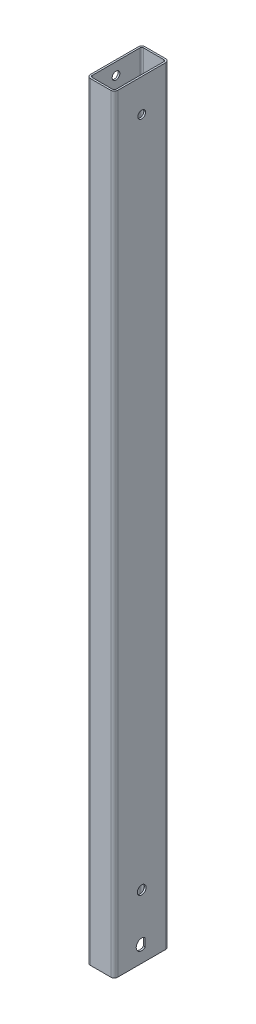
ISO-10303-21;
HEADER;
FILE_DESCRIPTION(('STEP AP214'),'2;1');
FILE_NAME('part.step','',(''),(''),'','','');
FILE_SCHEMA(('AUTOMOTIVE_DESIGN { 1 0 10303 214 1 1 1 1 }'));
ENDSEC;
DATA;
#1=APPLICATION_CONTEXT('core data for automotive mechanical design processes');
#2=APPLICATION_PROTOCOL_DEFINITION('international standard','automotive_design',2000,#1);
#3=PRODUCT_CONTEXT('',#1,'mechanical');
#4=PRODUCT('Part','Part','',(#3));
#5=PRODUCT_RELATED_PRODUCT_CATEGORY('part','',(#4));
#6=PRODUCT_DEFINITION_FORMATION('','',#4);
#7=PRODUCT_DEFINITION_CONTEXT('part definition',#1,'design');
#8=PRODUCT_DEFINITION('design','',#6,#7);
#9=PRODUCT_DEFINITION_SHAPE('','',#8);
#10=(LENGTH_UNIT() NAMED_UNIT(*) SI_UNIT(.MILLI.,.METRE.));
#11=(NAMED_UNIT(*) PLANE_ANGLE_UNIT() SI_UNIT($,.RADIAN.));
#12=(NAMED_UNIT(*) SI_UNIT($,.STERADIAN.) SOLID_ANGLE_UNIT());
#13=UNCERTAINTY_MEASURE_WITH_UNIT(LENGTH_MEASURE(1.E-05),#10,'distance_accuracy_value','');
#14=(GEOMETRIC_REPRESENTATION_CONTEXT(3) GLOBAL_UNCERTAINTY_ASSIGNED_CONTEXT((#13)) GLOBAL_UNIT_ASSIGNED_CONTEXT((#10,
#11,#12)) REPRESENTATION_CONTEXT('',''));
#15=CARTESIAN_POINT('',(0.,0.,0.));
#16=DIRECTION('',(0.,0.,1.));
#17=DIRECTION('',(1.,0.,0.));
#18=AXIS2_PLACEMENT_3D('',#15,#16,#17);
#19=CARTESIAN_POINT('',(12.5,0.,0.));
#20=DIRECTION('',(-1.,0.,0.));
#21=DIRECTION('',(0.,0.,1.));
#22=AXIS2_PLACEMENT_3D('',#19,#20,#21);
#23=CYLINDRICAL_SURFACE('',#22,5.);
#24=CARTESIAN_POINT('',(-10.9,0.,0.));
#25=DIRECTION('',(-1.,0.,0.));
#26=DIRECTION('',(0.,0.,1.));
#27=AXIS2_PLACEMENT_3D('',#24,#25,#26);
#28=CIRCLE('',#27,5.);
#29=CARTESIAN_POINT('',(-10.9,-4.33012701892219,-2.5));
#30=VERTEX_POINT('',#29);
#31=CARTESIAN_POINT('',(-10.9,4.33012701892219,-2.5));
#32=VERTEX_POINT('',#31);
#33=EDGE_CURVE('E308',#30,#32,#28,.T.);
#34=ORIENTED_EDGE('',*,*,#33,.F.);
#35=DIRECTION('',(-1.,0.,0.));
#36=VECTOR('',#35,1.);
#37=CARTESIAN_POINT('',(12.5,-4.33012701892219,-2.5));
#38=LINE('',#37,#36);
#39=CARTESIAN_POINT('',(-12.5,-4.33012701892219,-2.5));
#40=VERTEX_POINT('',#39);
#41=EDGE_CURVE('E361',#30,#40,#38,.T.);
#42=ORIENTED_EDGE('',*,*,#41,.T.);
#43=CARTESIAN_POINT('',(-12.5,0.,0.));
#44=DIRECTION('',(1.,0.,0.));
#45=DIRECTION('',(0.,0.,-1.));
#46=AXIS2_PLACEMENT_3D('',#43,#44,#45);
#47=CIRCLE('',#46,5.);
#48=CARTESIAN_POINT('',(-12.5,4.33012701892219,-2.5));
#49=VERTEX_POINT('',#48);
#50=EDGE_CURVE('E319',#49,#40,#47,.T.);
#51=ORIENTED_EDGE('',*,*,#50,.F.);
#52=DIRECTION('',(-1.,0.,0.));
#53=VECTOR('',#52,1.);
#54=CARTESIAN_POINT('',(12.5,4.33012701892219,-2.5));
#55=LINE('',#54,#53);
#56=EDGE_CURVE('E358',#49,#32,#55,.F.);
#57=ORIENTED_EDGE('',*,*,#56,.T.);
#58=EDGE_LOOP('',(#34,#42,#51,#57));
#59=FACE_BOUND('',#58,.T.);
#60=ADVANCED_FACE('F67',(#59),#23,.F.);
#61=CARTESIAN_POINT('',(-20.7462112512353,4.,-3.));
#62=DIRECTION('',(0.,0.,1.));
#63=DIRECTION('',(1.,0.,0.));
#64=AXIS2_PLACEMENT_3D('',#61,#62,#63);
#65=PLANE('',#64);
#66=DIRECTION('',(0.,-1.,0.));
#67=VECTOR('',#66,1.);
#68=CARTESIAN_POINT('',(-10.9,4.,-3.));
#69=LINE('',#68,#67);
#70=CARTESIAN_POINT('',(-10.9,3.46410161513775,-3.));
#71=VERTEX_POINT('',#70);
#72=CARTESIAN_POINT('',(-10.9,-3.46410161513775,-3.));
#73=VERTEX_POINT('',#72);
#74=EDGE_CURVE('E306',#71,#73,#69,.T.);
#75=ORIENTED_EDGE('',*,*,#74,.F.);
#76=DIRECTION('',(1.,0.,0.));
#77=VECTOR('',#76,1.);
#78=CARTESIAN_POINT('',(-12.5,3.46410161513775,-3.));
#79=LINE('',#78,#77);
#80=CARTESIAN_POINT('',(-12.5,3.46410161513775,-3.));
#81=VERTEX_POINT('',#80);
#82=EDGE_CURVE('E349',#71,#81,#79,.F.);
#83=ORIENTED_EDGE('',*,*,#82,.T.);
#84=DIRECTION('',(0.,-1.,0.));
#85=VECTOR('',#84,1.);
#86=CARTESIAN_POINT('',(-12.5,4.,-3.));
#87=LINE('',#86,#85);
#88=CARTESIAN_POINT('',(-12.5,-3.46410161513775,-3.));
#89=VERTEX_POINT('',#88);
#90=EDGE_CURVE('E316',#81,#89,#87,.T.);
#91=ORIENTED_EDGE('',*,*,#90,.T.);
#92=DIRECTION('',(1.,0.,0.));
#93=VECTOR('',#92,1.);
#94=CARTESIAN_POINT('',(12.5,-3.46410161513775,-3.));
#95=LINE('',#94,#93);
#96=EDGE_CURVE('E354',#89,#73,#95,.T.);
#97=ORIENTED_EDGE('',*,*,#96,.T.);
#98=EDGE_LOOP('',(#75,#83,#91,#97));
#99=FACE_BOUND('',#98,.T.);
#100=ADVANCED_FACE('F450',(#99),#65,.T.);
#101=CARTESIAN_POINT('',(12.5,-3.46410161513775,-2.));
#102=DIRECTION('',(-1.,0.,0.));
#103=DIRECTION('',(0.,0.,1.));
#104=AXIS2_PLACEMENT_3D('',#101,#102,#103);
#105=CYLINDRICAL_SURFACE('',#104,1.);
#106=ORIENTED_EDGE('',*,*,#41,.F.);
#107=CARTESIAN_POINT('',(-10.9,-3.46410161513775,-2.));
#108=DIRECTION('',(-1.,0.,0.));
#109=DIRECTION('',(0.,0.,1.));
#110=AXIS2_PLACEMENT_3D('',#107,#108,#109);
#111=CIRCLE('',#110,1.);
#112=EDGE_CURVE('E310',#30,#73,#111,.F.);
#113=ORIENTED_EDGE('',*,*,#112,.T.);
#114=ORIENTED_EDGE('',*,*,#96,.F.);
#115=CARTESIAN_POINT('',(-12.5,-3.46410161513775,-2.));
#116=DIRECTION('',(-1.,0.,0.));
#117=DIRECTION('',(0.,0.,1.));
#118=AXIS2_PLACEMENT_3D('',#115,#116,#117);
#119=CIRCLE('',#118,1.);
#120=EDGE_CURVE('E367',#40,#89,#119,.F.);
#121=ORIENTED_EDGE('',*,*,#120,.F.);
#122=EDGE_LOOP('',(#106,#113,#114,#121));
#123=FACE_BOUND('',#122,.T.);
#124=ADVANCED_FACE('F457',(#123),#105,.F.);
#125=CARTESIAN_POINT('',(12.5,3.46410161513775,-2.));
#126=DIRECTION('',(-1.,0.,0.));
#127=DIRECTION('',(0.,0.,1.));
#128=AXIS2_PLACEMENT_3D('',#125,#126,#127);
#129=CYLINDRICAL_SURFACE('',#128,1.);
#130=ORIENTED_EDGE('',*,*,#82,.F.);
#131=CARTESIAN_POINT('',(-10.9,3.46410161513775,-2.));
#132=DIRECTION('',(-1.,0.,0.));
#133=DIRECTION('',(0.,0.,1.));
#134=AXIS2_PLACEMENT_3D('',#131,#132,#133);
#135=CIRCLE('',#134,1.);
#136=EDGE_CURVE('E12',#71,#32,#135,.F.);
#137=ORIENTED_EDGE('',*,*,#136,.T.);
#138=ORIENTED_EDGE('',*,*,#56,.F.);
#139=CARTESIAN_POINT('',(-12.5,3.46410161513775,-2.));
#140=DIRECTION('',(-1.,0.,0.));
#141=DIRECTION('',(0.,0.,1.));
#142=AXIS2_PLACEMENT_3D('',#139,#140,#141);
#143=CIRCLE('',#142,1.);
#144=EDGE_CURVE('E371',#81,#49,#143,.F.);
#145=ORIENTED_EDGE('',*,*,#144,.F.);
#146=EDGE_LOOP('',(#130,#137,#138,#145));
#147=FACE_BOUND('',#146,.T.);
#148=ADVANCED_FACE('F491',(#147),#129,.F.);
#149=CARTESIAN_POINT('',(12.5,0.,0.));
#150=DIRECTION('',(-1.,0.,0.));
#151=DIRECTION('',(0.,0.,1.));
#152=AXIS2_PLACEMENT_3D('',#149,#150,#151);
#153=PLANE('',#152);
#154=CARTESIAN_POINT('',(12.5,655.,0.));
#155=DIRECTION('',(1.,0.,0.));
#156=DIRECTION('',(0.,0.,-1.));
#157=AXIS2_PLACEMENT_3D('',#154,#155,#156);
#158=CIRCLE('',#157,3.5);
#159=CARTESIAN_POINT('',(12.5,655.,-3.5));
#160=VERTEX_POINT('',#159);
#161=EDGE_CURVE('E555',#160,#160,#158,.T.);
#162=ORIENTED_EDGE('',*,*,#161,.F.);
#163=EDGE_LOOP('',(#162));
#164=FACE_BOUND('',#163,.T.);
#165=CARTESIAN_POINT('',(12.5,43.,0.));
#166=DIRECTION('',(1.,0.,0.));
#167=DIRECTION('',(0.,0.,-1.));
#168=AXIS2_PLACEMENT_3D('',#165,#166,#167);
#169=CIRCLE('',#168,4.);
#170=CARTESIAN_POINT('',(12.5,43.,-4.));
#171=VERTEX_POINT('',#170);
#172=EDGE_CURVE('E253',#171,#171,#169,.T.);
#173=ORIENTED_EDGE('',*,*,#172,.F.);
#174=EDGE_LOOP('',(#173));
#175=FACE_BOUND('',#174,.T.);
#176=DIRECTION('',(0.,0.,-1.));
#177=VECTOR('',#176,1.);
#178=CARTESIAN_POINT('',(12.5,-15.,25.));
#179=LINE('',#178,#177);
#180=CARTESIAN_POINT('',(12.5,-15.,21.8));
#181=VERTEX_POINT('',#180);
#182=CARTESIAN_POINT('',(12.5,-15.,-21.8));
#183=VERTEX_POINT('',#182);
#184=EDGE_CURVE('E329',#181,#183,#179,.T.);
#185=ORIENTED_EDGE('',*,*,#184,.T.);
#186=DIRECTION('',(0.,1.,0.));
#187=VECTOR('',#186,1.);
#188=CARTESIAN_POINT('',(12.5,0.,-21.8));
#189=LINE('',#188,#187);
#190=CARTESIAN_POINT('',(12.5,685.,-21.8));
#191=VERTEX_POINT('',#190);
#192=EDGE_CURVE('E376',#183,#191,#189,.T.);
#193=ORIENTED_EDGE('',*,*,#192,.T.);
#194=DIRECTION('',(0.,0.,1.));
#195=VECTOR('',#194,1.);
#196=CARTESIAN_POINT('',(12.5,685.,25.));
#197=LINE('',#196,#195);
#198=CARTESIAN_POINT('',(12.5,685.,21.8));
#199=VERTEX_POINT('',#198);
#200=EDGE_CURVE('E326',#191,#199,#197,.T.);
#201=ORIENTED_EDGE('',*,*,#200,.T.);
#202=DIRECTION('',(0.,-1.,0.));
#203=VECTOR('',#202,1.);
#204=CARTESIAN_POINT('',(12.5,0.,21.8));
#205=LINE('',#204,#203);
#206=EDGE_CURVE('E373',#199,#181,#205,.T.);
#207=ORIENTED_EDGE('',*,*,#206,.T.);
#208=EDGE_LOOP('',(#185,#193,#201,#207));
#209=FACE_BOUND('',#208,.T.);
#210=CARTESIAN_POINT('',(12.5,0.,0.));
#211=DIRECTION('',(1.,0.,0.));
#212=DIRECTION('',(0.,0.,-1.));
#213=AXIS2_PLACEMENT_3D('',#210,#211,#212);
#214=CIRCLE('',#213,5.);
#215=CARTESIAN_POINT('',(12.5,4.33012701892219,-2.5));
#216=VERTEX_POINT('',#215);
#217=CARTESIAN_POINT('',(12.5,-4.33012701892219,-2.5));
#218=VERTEX_POINT('',#217);
#219=EDGE_CURVE('E320',#216,#218,#214,.T.);
#220=ORIENTED_EDGE('',*,*,#219,.F.);
#221=CARTESIAN_POINT('',(12.5,3.46410161513775,-2.));
#222=DIRECTION('',(-1.,0.,0.));
#223=DIRECTION('',(0.,0.,1.));
#224=AXIS2_PLACEMENT_3D('',#221,#222,#223);
#225=CIRCLE('',#224,1.);
#226=CARTESIAN_POINT('',(12.5,3.46410161513775,-3.));
#227=VERTEX_POINT('',#226);
#228=EDGE_CURVE('E369',#216,#227,#225,.T.);
#229=ORIENTED_EDGE('',*,*,#228,.T.);
#230=DIRECTION('',(0.,-1.,0.));
#231=VECTOR('',#230,1.);
#232=CARTESIAN_POINT('',(12.5,4.,-3.));
#233=LINE('',#232,#231);
#234=CARTESIAN_POINT('',(12.5,-3.46410161513775,-3.));
#235=VERTEX_POINT('',#234);
#236=EDGE_CURVE('E313',#227,#235,#233,.T.);
#237=ORIENTED_EDGE('',*,*,#236,.T.);
#238=CARTESIAN_POINT('',(12.5,-3.46410161513775,-2.));
#239=DIRECTION('',(-1.,0.,0.));
#240=DIRECTION('',(0.,0.,1.));
#241=AXIS2_PLACEMENT_3D('',#238,#239,#240);
#242=CIRCLE('',#241,1.);
#243=EDGE_CURVE('E365',#235,#218,#242,.T.);
#244=ORIENTED_EDGE('',*,*,#243,.T.);
#245=EDGE_LOOP('',(#220,#229,#237,#244));
#246=FACE_BOUND('',#245,.T.);
#247=ADVANCED_FACE('F424',(#164,#175,#209,#246),#153,.F.);
#248=CARTESIAN_POINT('',(-12.5,0.,0.));
#249=DIRECTION('',(-1.,0.,0.));
#250=DIRECTION('',(0.,0.,1.));
#251=AXIS2_PLACEMENT_3D('',#248,#249,#250);
#252=PLANE('',#251);
#253=CARTESIAN_POINT('',(-12.5,674.,0.));
#254=DIRECTION('',(-1.,0.,0.));
#255=DIRECTION('',(0.,0.,1.));
#256=AXIS2_PLACEMENT_3D('',#253,#254,#255);
#257=CIRCLE('',#256,3.5);
#258=CARTESIAN_POINT('',(-12.5,674.,3.5));
#259=VERTEX_POINT('',#258);
#260=EDGE_CURVE('E587',#259,#259,#257,.T.);
#261=ORIENTED_EDGE('',*,*,#260,.F.);
#262=EDGE_LOOP('',(#261));
#263=FACE_BOUND('',#262,.T.);
#264=CARTESIAN_POINT('',(-12.5,656.,0.));
#265=DIRECTION('',(-1.,0.,0.));
#266=DIRECTION('',(0.,0.,1.));
#267=AXIS2_PLACEMENT_3D('',#264,#265,#266);
#268=CIRCLE('',#267,3.5);
#269=CARTESIAN_POINT('',(-12.5,656.,3.5));
#270=VERTEX_POINT('',#269);
#271=EDGE_CURVE('E584',#270,#270,#268,.T.);
#272=ORIENTED_EDGE('',*,*,#271,.F.);
#273=EDGE_LOOP('',(#272));
#274=FACE_BOUND('',#273,.T.);
#275=DIRECTION('',(0.,0.,1.));
#276=VECTOR('',#275,1.);
#277=CARTESIAN_POINT('',(-12.5,685.,25.));
#278=LINE('',#277,#276);
#279=CARTESIAN_POINT('',(-12.5,685.,-21.8));
#280=VERTEX_POINT('',#279);
#281=CARTESIAN_POINT('',(-12.5,685.,21.8));
#282=VERTEX_POINT('',#281);
#283=EDGE_CURVE('E323',#280,#282,#278,.T.);
#284=ORIENTED_EDGE('',*,*,#283,.F.);
#285=DIRECTION('',(0.,1.,0.));
#286=VECTOR('',#285,1.);
#287=CARTESIAN_POINT('',(-12.5,-15.,-21.8));
#288=LINE('',#287,#286);
#289=CARTESIAN_POINT('',(-12.5,-15.,-21.8));
#290=VERTEX_POINT('',#289);
#291=EDGE_CURVE('E402',#280,#290,#288,.F.);
#292=ORIENTED_EDGE('',*,*,#291,.T.);
#293=DIRECTION('',(0.,0.,-1.));
#294=VECTOR('',#293,1.);
#295=CARTESIAN_POINT('',(-12.5,-15.,25.));
#296=LINE('',#295,#294);
#297=CARTESIAN_POINT('',(-12.5,-15.,21.8));
#298=VERTEX_POINT('',#297);
#299=EDGE_CURVE('E330',#298,#290,#296,.T.);
#300=ORIENTED_EDGE('',*,*,#299,.F.);
#301=DIRECTION('',(0.,-1.,0.));
#302=VECTOR('',#301,1.);
#303=CARTESIAN_POINT('',(-12.5,685.,21.8));
#304=LINE('',#303,#302);
#305=EDGE_CURVE('E400',#298,#282,#304,.F.);
#306=ORIENTED_EDGE('',*,*,#305,.T.);
#307=EDGE_LOOP('',(#284,#292,#300,#306));
#308=FACE_BOUND('',#307,.T.);
#309=ORIENTED_EDGE('',*,*,#90,.F.);
#310=ORIENTED_EDGE('',*,*,#144,.T.);
#311=ORIENTED_EDGE('',*,*,#50,.T.);
#312=ORIENTED_EDGE('',*,*,#120,.T.);
#313=EDGE_LOOP('',(#309,#310,#311,#312));
#314=FACE_BOUND('',#313,.T.);
#315=ADVANCED_FACE('F479',(#263,#274,#308,#314),#252,.T.);
#316=CARTESIAN_POINT('',(12.5,-15.,-25.));
#317=DIRECTION('',(0.,0.,1.));
#318=DIRECTION('',(1.,0.,0.));
#319=AXIS2_PLACEMENT_3D('',#316,#317,#318);
#320=PLANE('',#319);
#321=CARTESIAN_POINT('',(0.,665.,-25.));
#322=DIRECTION('',(0.,0.,-1.));
#323=DIRECTION('',(-1.,0.,0.));
#324=AXIS2_PLACEMENT_3D('',#321,#322,#323);
#325=CIRCLE('',#324,5.);
#326=CARTESIAN_POINT('',(-5.,665.,-25.));
#327=VERTEX_POINT('',#326);
#328=EDGE_CURVE('E568',#327,#327,#325,.T.);
#329=ORIENTED_EDGE('',*,*,#328,.F.);
#330=EDGE_LOOP('',(#329));
#331=FACE_BOUND('',#330,.T.);
#332=CARTESIAN_POINT('',(0.,565.,-25.));
#333=DIRECTION('',(0.,0.,-1.));
#334=DIRECTION('',(-1.,0.,0.));
#335=AXIS2_PLACEMENT_3D('',#332,#333,#334);
#336=CIRCLE('',#335,5.);
#337=CARTESIAN_POINT('',(-5.00000000000002,565.,-25.));
#338=VERTEX_POINT('',#337);
#339=EDGE_CURVE('E573',#338,#338,#336,.T.);
#340=ORIENTED_EDGE('',*,*,#339,.F.);
#341=EDGE_LOOP('',(#340));
#342=FACE_BOUND('',#341,.T.);
#343=DIRECTION('',(-1.,0.,0.));
#344=VECTOR('',#343,1.);
#345=CARTESIAN_POINT('',(12.5,685.,-25.));
#346=LINE('',#345,#344);
#347=CARTESIAN_POINT('',(9.3,685.,-25.));
#348=VERTEX_POINT('',#347);
#349=CARTESIAN_POINT('',(-9.3,685.,-25.));
#350=VERTEX_POINT('',#349);
#351=EDGE_CURVE('E346',#348,#350,#346,.T.);
#352=ORIENTED_EDGE('',*,*,#351,.F.);
#353=DIRECTION('',(0.,1.,0.));
#354=VECTOR('',#353,1.);
#355=CARTESIAN_POINT('',(9.3,-15.,-25.));
#356=LINE('',#355,#354);
#357=CARTESIAN_POINT('',(9.3,-15.,-25.));
#358=VERTEX_POINT('',#357);
#359=EDGE_CURVE('E390',#348,#358,#356,.F.);
#360=ORIENTED_EDGE('',*,*,#359,.T.);
#361=DIRECTION('',(-1.,0.,0.));
#362=VECTOR('',#361,1.);
#363=CARTESIAN_POINT('',(12.5,-15.,-25.));
#364=LINE('',#363,#362);
#365=CARTESIAN_POINT('',(-9.3,-15.,-25.));
#366=VERTEX_POINT('',#365);
#367=EDGE_CURVE('E333',#358,#366,#364,.T.);
#368=ORIENTED_EDGE('',*,*,#367,.T.);
#369=DIRECTION('',(0.,1.,0.));
#370=VECTOR('',#369,1.);
#371=CARTESIAN_POINT('',(-9.3,685.,-25.));
#372=LINE('',#371,#370);
#373=EDGE_CURVE('E387',#366,#350,#372,.T.);
#374=ORIENTED_EDGE('',*,*,#373,.T.);
#375=EDGE_LOOP('',(#352,#360,#368,#374));
#376=FACE_BOUND('',#375,.T.);
#377=ADVANCED_FACE('F482',(#331,#342,#376),#320,.F.);
#378=CARTESIAN_POINT('',(12.5,685.,25.));
#379=DIRECTION('',(0.,-1.,0.));
#380=DIRECTION('',(0.,0.,-1.));
#381=AXIS2_PLACEMENT_3D('',#378,#379,#380);
#382=PLANE('',#381);
#383=DIRECTION('',(0.,0.,-1.));
#384=VECTOR('',#383,1.);
#385=CARTESIAN_POINT('',(-10.9,685.,21.8));
#386=LINE('',#385,#384);
#387=CARTESIAN_POINT('',(-10.9,685.,21.8));
#388=VERTEX_POINT('',#387);
#389=CARTESIAN_POINT('',(-10.9,685.,-21.8));
#390=VERTEX_POINT('',#389);
#391=EDGE_CURVE('E236',#388,#390,#386,.T.);
#392=ORIENTED_EDGE('',*,*,#391,.T.);
#393=CARTESIAN_POINT('',(-9.3,685.,-21.8));
#394=DIRECTION('',(0.,-1.,0.));
#395=DIRECTION('',(0.,0.,-1.));
#396=AXIS2_PLACEMENT_3D('',#393,#394,#395);
#397=CIRCLE('',#396,1.6);
#398=CARTESIAN_POINT('',(-9.3,685.,-23.4));
#399=VERTEX_POINT('',#398);
#400=EDGE_CURVE('E230',#390,#399,#397,.T.);
#401=ORIENTED_EDGE('',*,*,#400,.T.);
#402=DIRECTION('',(1.,0.,0.));
#403=VECTOR('',#402,1.);
#404=CARTESIAN_POINT('',(-9.3,685.,-23.4));
#405=LINE('',#404,#403);
#406=CARTESIAN_POINT('',(9.3,685.,-23.4));
#407=VERTEX_POINT('',#406);
#408=EDGE_CURVE('E239',#399,#407,#405,.T.);
#409=ORIENTED_EDGE('',*,*,#408,.T.);
#410=CARTESIAN_POINT('',(9.3,685.,-21.8));
#411=DIRECTION('',(0.,-1.,0.));
#412=DIRECTION('',(0.,0.,-1.));
#413=AXIS2_PLACEMENT_3D('',#410,#411,#412);
#414=CIRCLE('',#413,1.6);
#415=CARTESIAN_POINT('',(10.9,685.,-21.8));
#416=VERTEX_POINT('',#415);
#417=EDGE_CURVE('E82',#407,#416,#414,.T.);
#418=ORIENTED_EDGE('',*,*,#417,.T.);
#419=DIRECTION('',(0.,0.,1.));
#420=VECTOR('',#419,1.);
#421=CARTESIAN_POINT('',(10.9,685.,-21.8));
#422=LINE('',#421,#420);
#423=CARTESIAN_POINT('',(10.9,685.,21.8));
#424=VERTEX_POINT('',#423);
#425=EDGE_CURVE('E257',#416,#424,#422,.T.);
#426=ORIENTED_EDGE('',*,*,#425,.T.);
#427=CARTESIAN_POINT('',(9.3,685.,21.8));
#428=DIRECTION('',(0.,-1.,0.));
#429=DIRECTION('',(0.,0.,-1.));
#430=AXIS2_PLACEMENT_3D('',#427,#428,#429);
#431=CIRCLE('',#430,1.6);
#432=CARTESIAN_POINT('',(9.3,685.,23.4));
#433=VERTEX_POINT('',#432);
#434=EDGE_CURVE('E260',#424,#433,#431,.T.);
#435=ORIENTED_EDGE('',*,*,#434,.T.);
#436=DIRECTION('',(-1.,0.,0.));
#437=VECTOR('',#436,1.);
#438=CARTESIAN_POINT('',(9.3,685.,23.4));
#439=LINE('',#438,#437);
#440=CARTESIAN_POINT('',(-9.3,685.,23.4));
#441=VERTEX_POINT('',#440);
#442=EDGE_CURVE('E263',#433,#441,#439,.T.);
#443=ORIENTED_EDGE('',*,*,#442,.T.);
#444=CARTESIAN_POINT('',(-9.3,685.,21.8));
#445=DIRECTION('',(0.,-1.,0.));
#446=DIRECTION('',(0.,0.,-1.));
#447=AXIS2_PLACEMENT_3D('',#444,#445,#446);
#448=CIRCLE('',#447,1.6);
#449=EDGE_CURVE('E266',#441,#388,#448,.T.);
#450=ORIENTED_EDGE('',*,*,#449,.T.);
#451=EDGE_LOOP('',(#392,#401,#409,#418,#426,#435,#443,#450));
#452=FACE_BOUND('',#451,.T.);
#453=ORIENTED_EDGE('',*,*,#200,.F.);
#454=CARTESIAN_POINT('',(9.3,685.,-21.8));
#455=DIRECTION('',(0.,-1.,0.));
#456=DIRECTION('',(0.,0.,-1.));
#457=AXIS2_PLACEMENT_3D('',#454,#455,#456);
#458=CIRCLE('',#457,3.2);
#459=EDGE_CURVE('E385',#191,#348,#458,.F.);
#460=ORIENTED_EDGE('',*,*,#459,.T.);
#461=ORIENTED_EDGE('',*,*,#351,.T.);
#462=CARTESIAN_POINT('',(-9.3,685.,-21.8));
#463=DIRECTION('',(0.,-1.,0.));
#464=DIRECTION('',(0.,0.,-1.));
#465=AXIS2_PLACEMENT_3D('',#462,#463,#464);
#466=CIRCLE('',#465,3.2);
#467=EDGE_CURVE('E383',#350,#280,#466,.F.);
#468=ORIENTED_EDGE('',*,*,#467,.T.);
#469=ORIENTED_EDGE('',*,*,#283,.T.);
#470=CARTESIAN_POINT('',(-9.3,685.,21.8));
#471=DIRECTION('',(0.,-1.,0.));
#472=DIRECTION('',(0.,0.,-1.));
#473=AXIS2_PLACEMENT_3D('',#470,#471,#472);
#474=CIRCLE('',#473,3.2);
#475=CARTESIAN_POINT('',(-9.3,685.,25.));
#476=VERTEX_POINT('',#475);
#477=EDGE_CURVE('E379',#282,#476,#474,.F.);
#478=ORIENTED_EDGE('',*,*,#477,.T.);
#479=DIRECTION('',(-1.,0.,0.));
#480=VECTOR('',#479,1.);
#481=CARTESIAN_POINT('',(12.5,685.,25.));
#482=LINE('',#481,#480);
#483=CARTESIAN_POINT('',(9.3,685.,25.));
#484=VERTEX_POINT('',#483);
#485=EDGE_CURVE('E343',#484,#476,#482,.T.);
#486=ORIENTED_EDGE('',*,*,#485,.F.);
#487=CARTESIAN_POINT('',(9.3,685.,21.8));
#488=DIRECTION('',(0.,-1.,0.));
#489=DIRECTION('',(0.,0.,-1.));
#490=AXIS2_PLACEMENT_3D('',#487,#488,#489);
#491=CIRCLE('',#490,3.2);
#492=EDGE_CURVE('E381',#484,#199,#491,.F.);
#493=ORIENTED_EDGE('',*,*,#492,.T.);
#494=EDGE_LOOP('',(#453,#460,#461,#468,#469,#478,#486,#493));
#495=FACE_BOUND('',#494,.T.);
#496=ADVANCED_FACE('F243',(#452,#495),#382,.F.);
#497=CARTESIAN_POINT('',(12.5,-15.,25.));
#498=DIRECTION('',(0.,0.,-1.));
#499=DIRECTION('',(-1.,0.,0.));
#500=AXIS2_PLACEMENT_3D('',#497,#498,#499);
#501=PLANE('',#500);
#502=DIRECTION('',(-1.,0.,0.));
#503=VECTOR('',#502,1.);
#504=CARTESIAN_POINT('',(12.5,-15.,25.));
#505=LINE('',#504,#503);
#506=CARTESIAN_POINT('',(9.3,-15.,25.));
#507=VERTEX_POINT('',#506);
#508=CARTESIAN_POINT('',(-9.3,-15.,25.));
#509=VERTEX_POINT('',#508);
#510=EDGE_CURVE('E340',#507,#509,#505,.T.);
#511=ORIENTED_EDGE('',*,*,#510,.F.);
#512=DIRECTION('',(0.,-1.,0.));
#513=VECTOR('',#512,1.);
#514=CARTESIAN_POINT('',(9.3,-15.,25.));
#515=LINE('',#514,#513);
#516=EDGE_CURVE('E407',#507,#484,#515,.F.);
#517=ORIENTED_EDGE('',*,*,#516,.T.);
#518=ORIENTED_EDGE('',*,*,#485,.T.);
#519=DIRECTION('',(0.,-1.,0.));
#520=VECTOR('',#519,1.);
#521=CARTESIAN_POINT('',(-9.3,-15.,25.));
#522=LINE('',#521,#520);
#523=EDGE_CURVE('E404',#476,#509,#522,.T.);
#524=ORIENTED_EDGE('',*,*,#523,.T.);
#525=EDGE_LOOP('',(#511,#517,#518,#524));
#526=FACE_BOUND('',#525,.T.);
#527=ADVANCED_FACE('F468',(#526),#501,.F.);
#528=CARTESIAN_POINT('',(12.5,-15.,25.));
#529=DIRECTION('',(0.,1.,0.));
#530=DIRECTION('',(0.,0.,1.));
#531=AXIS2_PLACEMENT_3D('',#528,#529,#530);
#532=PLANE('',#531);
#533=DIRECTION('',(1.,0.,0.));
#534=VECTOR('',#533,1.);
#535=CARTESIAN_POINT('',(-9.3,-15.,-23.4));
#536=LINE('',#535,#534);
#537=CARTESIAN_POINT('',(-9.3,-15.,-23.4));
#538=VERTEX_POINT('',#537);
#539=CARTESIAN_POINT('',(9.3,-15.,-23.4));
#540=VERTEX_POINT('',#539);
#541=EDGE_CURVE('E270',#538,#540,#536,.T.);
#542=ORIENTED_EDGE('',*,*,#541,.F.);
#543=CARTESIAN_POINT('',(-9.3,-15.,-21.8));
#544=DIRECTION('',(0.,-1.,0.));
#545=DIRECTION('',(0.,0.,-1.));
#546=AXIS2_PLACEMENT_3D('',#543,#544,#545);
#547=CIRCLE('',#546,1.6);
#548=CARTESIAN_POINT('',(-10.9,-15.,-21.8));
#549=VERTEX_POINT('',#548);
#550=EDGE_CURVE('E90',#549,#538,#547,.T.);
#551=ORIENTED_EDGE('',*,*,#550,.F.);
#552=DIRECTION('',(0.,0.,-1.));
#553=VECTOR('',#552,1.);
#554=CARTESIAN_POINT('',(-10.9,-15.,21.8));
#555=LINE('',#554,#553);
#556=CARTESIAN_POINT('',(-10.9,-15.,21.8));
#557=VERTEX_POINT('',#556);
#558=EDGE_CURVE('E247',#557,#549,#555,.T.);
#559=ORIENTED_EDGE('',*,*,#558,.F.);
#560=CARTESIAN_POINT('',(-9.3,-15.,21.8));
#561=DIRECTION('',(0.,-1.,0.));
#562=DIRECTION('',(0.,0.,-1.));
#563=AXIS2_PLACEMENT_3D('',#560,#561,#562);
#564=CIRCLE('',#563,1.6);
#565=CARTESIAN_POINT('',(-9.3,-15.,23.4));
#566=VERTEX_POINT('',#565);
#567=EDGE_CURVE('E250',#566,#557,#564,.T.);
#568=ORIENTED_EDGE('',*,*,#567,.F.);
#569=DIRECTION('',(-1.,0.,0.));
#570=VECTOR('',#569,1.);
#571=CARTESIAN_POINT('',(9.3,-15.,23.4));
#572=LINE('',#571,#570);
#573=CARTESIAN_POINT('',(9.3,-15.,23.4));
#574=VERTEX_POINT('',#573);
#575=EDGE_CURVE('E281',#574,#566,#572,.T.);
#576=ORIENTED_EDGE('',*,*,#575,.F.);
#577=CARTESIAN_POINT('',(9.3,-15.,21.8));
#578=DIRECTION('',(0.,-1.,0.));
#579=DIRECTION('',(0.,0.,-1.));
#580=AXIS2_PLACEMENT_3D('',#577,#578,#579);
#581=CIRCLE('',#580,1.6);
#582=CARTESIAN_POINT('',(10.9,-15.,21.8));
#583=VERTEX_POINT('',#582);
#584=EDGE_CURVE('E278',#583,#574,#581,.T.);
#585=ORIENTED_EDGE('',*,*,#584,.F.);
#586=DIRECTION('',(0.,0.,1.));
#587=VECTOR('',#586,1.);
#588=CARTESIAN_POINT('',(10.9,-15.,-21.8));
#589=LINE('',#588,#587);
#590=CARTESIAN_POINT('',(10.9,-15.,-21.8));
#591=VERTEX_POINT('',#590);
#592=EDGE_CURVE('E275',#591,#583,#589,.T.);
#593=ORIENTED_EDGE('',*,*,#592,.F.);
#594=CARTESIAN_POINT('',(9.3,-15.,-21.8));
#595=DIRECTION('',(0.,-1.,0.));
#596=DIRECTION('',(0.,0.,-1.));
#597=AXIS2_PLACEMENT_3D('',#594,#595,#596);
#598=CIRCLE('',#597,1.6);
#599=EDGE_CURVE('E272',#540,#591,#598,.T.);
#600=ORIENTED_EDGE('',*,*,#599,.F.);
#601=EDGE_LOOP('',(#542,#551,#559,#568,#576,#585,#593,#600));
#602=FACE_BOUND('',#601,.T.);
#603=ORIENTED_EDGE('',*,*,#367,.F.);
#604=CARTESIAN_POINT('',(9.3,-15.,-21.8));
#605=DIRECTION('',(0.,1.,0.));
#606=DIRECTION('',(0.,0.,1.));
#607=AXIS2_PLACEMENT_3D('',#604,#605,#606);
#608=CIRCLE('',#607,3.2);
#609=EDGE_CURVE('E398',#358,#183,#608,.F.);
#610=ORIENTED_EDGE('',*,*,#609,.T.);
#611=ORIENTED_EDGE('',*,*,#184,.F.);
#612=CARTESIAN_POINT('',(9.3,-15.,21.8));
#613=DIRECTION('',(0.,1.,0.));
#614=DIRECTION('',(0.,0.,1.));
#615=AXIS2_PLACEMENT_3D('',#612,#613,#614);
#616=CIRCLE('',#615,3.2);
#617=EDGE_CURVE('E394',#181,#507,#616,.F.);
#618=ORIENTED_EDGE('',*,*,#617,.T.);
#619=ORIENTED_EDGE('',*,*,#510,.T.);
#620=CARTESIAN_POINT('',(-9.3,-15.,21.8));
#621=DIRECTION('',(0.,1.,0.));
#622=DIRECTION('',(0.,0.,1.));
#623=AXIS2_PLACEMENT_3D('',#620,#621,#622);
#624=CIRCLE('',#623,3.2);
#625=EDGE_CURVE('E392',#509,#298,#624,.F.);
#626=ORIENTED_EDGE('',*,*,#625,.T.);
#627=ORIENTED_EDGE('',*,*,#299,.T.);
#628=CARTESIAN_POINT('',(-9.3,-15.,-21.8));
#629=DIRECTION('',(0.,1.,0.));
#630=DIRECTION('',(0.,0.,1.));
#631=AXIS2_PLACEMENT_3D('',#628,#629,#630);
#632=CIRCLE('',#631,3.2);
#633=EDGE_CURVE('E396',#290,#366,#632,.F.);
#634=ORIENTED_EDGE('',*,*,#633,.T.);
#635=EDGE_LOOP('',(#603,#610,#611,#618,#619,#626,#627,#634));
#636=FACE_BOUND('',#635,.T.);
#637=ADVANCED_FACE('F463',(#602,#636),#532,.F.);
#638=CARTESIAN_POINT('',(10.9,0.,0.));
#639=DIRECTION('',(1.,0.,0.));
#640=DIRECTION('',(0.,0.,-1.));
#641=AXIS2_PLACEMENT_3D('',#638,#639,#640);
#642=CIRCLE('',#641,5.);
#643=CARTESIAN_POINT('',(10.9,4.33012701892219,-2.5));
#644=VERTEX_POINT('',#643);
#645=CARTESIAN_POINT('',(10.9,-4.33012701892219,-2.5));
#646=VERTEX_POINT('',#645);
#647=EDGE_CURVE('E301',#644,#646,#642,.T.);
#648=ORIENTED_EDGE('',*,*,#647,.F.);
#649=EDGE_CURVE('E357',#644,#216,#55,.F.);
#650=ORIENTED_EDGE('',*,*,#649,.T.);
#651=ORIENTED_EDGE('',*,*,#219,.T.);
#652=EDGE_CURVE('E362',#218,#646,#38,.T.);
#653=ORIENTED_EDGE('',*,*,#652,.T.);
#654=EDGE_LOOP('',(#648,#650,#651,#653));
#655=FACE_BOUND('',#654,.T.);
#656=ADVANCED_FACE('F427',(#655),#23,.F.);
#657=DIRECTION('',(0.,1.,0.));
#658=VECTOR('',#657,1.);
#659=CARTESIAN_POINT('',(10.9,4.,-3.));
#660=LINE('',#659,#658);
#661=CARTESIAN_POINT('',(10.9,-3.46410161513775,-3.));
#662=VERTEX_POINT('',#661);
#663=CARTESIAN_POINT('',(10.9,3.46410161513775,-3.));
#664=VERTEX_POINT('',#663);
#665=EDGE_CURVE('E288',#662,#664,#660,.T.);
#666=ORIENTED_EDGE('',*,*,#665,.F.);
#667=EDGE_CURVE('E353',#662,#235,#95,.T.);
#668=ORIENTED_EDGE('',*,*,#667,.T.);
#669=ORIENTED_EDGE('',*,*,#236,.F.);
#670=EDGE_CURVE('E350',#227,#664,#79,.F.);
#671=ORIENTED_EDGE('',*,*,#670,.T.);
#672=EDGE_LOOP('',(#666,#668,#669,#671));
#673=FACE_BOUND('',#672,.T.);
#674=ADVANCED_FACE('F419',(#673),#65,.T.);
#675=ORIENTED_EDGE('',*,*,#667,.F.);
#676=CARTESIAN_POINT('',(10.9,-3.46410161513775,-2.));
#677=DIRECTION('',(1.,0.,0.));
#678=DIRECTION('',(0.,0.,-1.));
#679=AXIS2_PLACEMENT_3D('',#676,#677,#678);
#680=CIRCLE('',#679,1.);
#681=EDGE_CURVE('E303',#662,#646,#680,.F.);
#682=ORIENTED_EDGE('',*,*,#681,.T.);
#683=ORIENTED_EDGE('',*,*,#652,.F.);
#684=ORIENTED_EDGE('',*,*,#243,.F.);
#685=EDGE_LOOP('',(#675,#682,#683,#684));
#686=FACE_BOUND('',#685,.T.);
#687=ADVANCED_FACE('F429',(#686),#105,.F.);
#688=ORIENTED_EDGE('',*,*,#649,.F.);
#689=CARTESIAN_POINT('',(10.9,3.46410161513775,-2.));
#690=DIRECTION('',(1.,0.,0.));
#691=DIRECTION('',(0.,0.,-1.));
#692=AXIS2_PLACEMENT_3D('',#689,#690,#691);
#693=CIRCLE('',#692,1.);
#694=EDGE_CURVE('E75',#644,#664,#693,.F.);
#695=ORIENTED_EDGE('',*,*,#694,.T.);
#696=ORIENTED_EDGE('',*,*,#670,.F.);
#697=ORIENTED_EDGE('',*,*,#228,.F.);
#698=EDGE_LOOP('',(#688,#695,#696,#697));
#699=FACE_BOUND('',#698,.T.);
#700=ADVANCED_FACE('F412',(#699),#129,.F.);
#701=CARTESIAN_POINT('',(9.3,0.,-21.8));
#702=DIRECTION('',(0.,1.,0.));
#703=DIRECTION('',(0.,0.,1.));
#704=AXIS2_PLACEMENT_3D('',#701,#702,#703);
#705=CYLINDRICAL_SURFACE('',#704,3.2);
#706=ORIENTED_EDGE('',*,*,#609,.F.);
#707=ORIENTED_EDGE('',*,*,#359,.F.);
#708=ORIENTED_EDGE('',*,*,#459,.F.);
#709=ORIENTED_EDGE('',*,*,#192,.F.);
#710=EDGE_LOOP('',(#706,#707,#708,#709));
#711=FACE_BOUND('',#710,.T.);
#712=ADVANCED_FACE('F490',(#711),#705,.T.);
#713=CARTESIAN_POINT('',(-9.3,-15.,-21.8));
#714=DIRECTION('',(0.,-1.,0.));
#715=DIRECTION('',(0.,0.,-1.));
#716=AXIS2_PLACEMENT_3D('',#713,#714,#715);
#717=CYLINDRICAL_SURFACE('',#716,3.2);
#718=ORIENTED_EDGE('',*,*,#633,.F.);
#719=ORIENTED_EDGE('',*,*,#291,.F.);
#720=ORIENTED_EDGE('',*,*,#467,.F.);
#721=ORIENTED_EDGE('',*,*,#373,.F.);
#722=EDGE_LOOP('',(#718,#719,#720,#721));
#723=FACE_BOUND('',#722,.T.);
#724=ADVANCED_FACE('F494',(#723),#717,.T.);
#725=CARTESIAN_POINT('',(9.3,0.,21.8));
#726=DIRECTION('',(0.,-1.,0.));
#727=DIRECTION('',(0.,0.,-1.));
#728=AXIS2_PLACEMENT_3D('',#725,#726,#727);
#729=CYLINDRICAL_SURFACE('',#728,3.2);
#730=ORIENTED_EDGE('',*,*,#492,.F.);
#731=ORIENTED_EDGE('',*,*,#516,.F.);
#732=ORIENTED_EDGE('',*,*,#617,.F.);
#733=ORIENTED_EDGE('',*,*,#206,.F.);
#734=EDGE_LOOP('',(#730,#731,#732,#733));
#735=FACE_BOUND('',#734,.T.);
#736=ADVANCED_FACE('F497',(#735),#729,.T.);
#737=CARTESIAN_POINT('',(-9.3,-15.,21.8));
#738=DIRECTION('',(0.,1.,0.));
#739=DIRECTION('',(0.,0.,1.));
#740=AXIS2_PLACEMENT_3D('',#737,#738,#739);
#741=CYLINDRICAL_SURFACE('',#740,3.2);
#742=ORIENTED_EDGE('',*,*,#477,.F.);
#743=ORIENTED_EDGE('',*,*,#305,.F.);
#744=ORIENTED_EDGE('',*,*,#625,.F.);
#745=ORIENTED_EDGE('',*,*,#523,.F.);
#746=EDGE_LOOP('',(#742,#743,#744,#745));
#747=FACE_BOUND('',#746,.T.);
#748=ADVANCED_FACE('F69',(#747),#741,.T.);
#749=CARTESIAN_POINT('',(-10.9,685.,21.8));
#750=DIRECTION('',(-1.,0.,0.));
#751=DIRECTION('',(0.,0.,1.));
#752=AXIS2_PLACEMENT_3D('',#749,#750,#751);
#753=PLANE('',#752);
#754=CARTESIAN_POINT('',(-10.9,674.,0.));
#755=DIRECTION('',(-1.,0.,0.));
#756=DIRECTION('',(0.,0.,1.));
#757=AXIS2_PLACEMENT_3D('',#754,#755,#756);
#758=CIRCLE('',#757,3.5);
#759=CARTESIAN_POINT('',(-10.9,674.,3.5));
#760=VERTEX_POINT('',#759);
#761=EDGE_CURVE('E576',#760,#760,#758,.F.);
#762=ORIENTED_EDGE('',*,*,#761,.F.);
#763=EDGE_LOOP('',(#762));
#764=FACE_BOUND('',#763,.T.);
#765=CARTESIAN_POINT('',(-10.9,656.,0.));
#766=DIRECTION('',(-1.,0.,0.));
#767=DIRECTION('',(0.,0.,1.));
#768=AXIS2_PLACEMENT_3D('',#765,#766,#767);
#769=CIRCLE('',#768,3.5);
#770=CARTESIAN_POINT('',(-10.9,656.,3.5));
#771=VERTEX_POINT('',#770);
#772=EDGE_CURVE('E581',#771,#771,#769,.F.);
#773=ORIENTED_EDGE('',*,*,#772,.F.);
#774=EDGE_LOOP('',(#773));
#775=FACE_BOUND('',#774,.T.);
#776=ORIENTED_EDGE('',*,*,#558,.T.);
#777=DIRECTION('',(0.,-1.,0.));
#778=VECTOR('',#777,1.);
#779=CARTESIAN_POINT('',(-10.9,685.,-21.8));
#780=LINE('',#779,#778);
#781=EDGE_CURVE('E286',#390,#549,#780,.T.);
#782=ORIENTED_EDGE('',*,*,#781,.F.);
#783=ORIENTED_EDGE('',*,*,#391,.F.);
#784=DIRECTION('',(0.,-1.,0.));
#785=VECTOR('',#784,1.);
#786=CARTESIAN_POINT('',(-10.9,685.,21.8));
#787=LINE('',#786,#785);
#788=EDGE_CURVE('E289',#388,#557,#787,.T.);
#789=ORIENTED_EDGE('',*,*,#788,.T.);
#790=EDGE_LOOP('',(#776,#782,#783,#789));
#791=FACE_BOUND('',#790,.T.);
#792=ORIENTED_EDGE('',*,*,#33,.T.);
#793=ORIENTED_EDGE('',*,*,#136,.F.);
#794=ORIENTED_EDGE('',*,*,#74,.T.);
#795=ORIENTED_EDGE('',*,*,#112,.F.);
#796=EDGE_LOOP('',(#792,#793,#794,#795));
#797=FACE_BOUND('',#796,.T.);
#798=ADVANCED_FACE('F432',(#764,#775,#791,#797),#753,.F.);
#799=CARTESIAN_POINT('',(10.9,685.,-21.8));
#800=DIRECTION('',(1.,0.,0.));
#801=DIRECTION('',(0.,0.,-1.));
#802=AXIS2_PLACEMENT_3D('',#799,#800,#801);
#803=PLANE('',#802);
#804=CARTESIAN_POINT('',(10.9,655.,0.));
#805=DIRECTION('',(1.,0.,0.));
#806=DIRECTION('',(0.,0.,-1.));
#807=AXIS2_PLACEMENT_3D('',#804,#805,#806);
#808=CIRCLE('',#807,3.5);
#809=CARTESIAN_POINT('',(10.9,655.,-3.5));
#810=VERTEX_POINT('',#809);
#811=EDGE_CURVE('E563',#810,#810,#808,.F.);
#812=ORIENTED_EDGE('',*,*,#811,.F.);
#813=EDGE_LOOP('',(#812));
#814=FACE_BOUND('',#813,.T.);
#815=CARTESIAN_POINT('',(10.9,43.,0.));
#816=DIRECTION('',(1.,0.,0.));
#817=DIRECTION('',(0.,0.,-1.));
#818=AXIS2_PLACEMENT_3D('',#815,#816,#817);
#819=CIRCLE('',#818,4.);
#820=CARTESIAN_POINT('',(10.9,43.,-4.));
#821=VERTEX_POINT('',#820);
#822=EDGE_CURVE('E559',#821,#821,#819,.F.);
#823=ORIENTED_EDGE('',*,*,#822,.F.);
#824=EDGE_LOOP('',(#823));
#825=FACE_BOUND('',#824,.T.);
#826=ORIENTED_EDGE('',*,*,#592,.T.);
#827=DIRECTION('',(0.,-1.,0.));
#828=VECTOR('',#827,1.);
#829=CARTESIAN_POINT('',(10.9,685.,21.8));
#830=LINE('',#829,#828);
#831=EDGE_CURVE('E295',#424,#583,#830,.T.);
#832=ORIENTED_EDGE('',*,*,#831,.F.);
#833=ORIENTED_EDGE('',*,*,#425,.F.);
#834=DIRECTION('',(0.,-1.,0.));
#835=VECTOR('',#834,1.);
#836=CARTESIAN_POINT('',(10.9,685.,-21.8));
#837=LINE('',#836,#835);
#838=EDGE_CURVE('E297',#416,#591,#837,.T.);
#839=ORIENTED_EDGE('',*,*,#838,.T.);
#840=EDGE_LOOP('',(#826,#832,#833,#839));
#841=FACE_BOUND('',#840,.T.);
#842=ORIENTED_EDGE('',*,*,#665,.T.);
#843=ORIENTED_EDGE('',*,*,#694,.F.);
#844=ORIENTED_EDGE('',*,*,#647,.T.);
#845=ORIENTED_EDGE('',*,*,#681,.F.);
#846=EDGE_LOOP('',(#842,#843,#844,#845));
#847=FACE_BOUND('',#846,.T.);
#848=ADVANCED_FACE('F430',(#814,#825,#841,#847),#803,.F.);
#849=CARTESIAN_POINT('',(-9.3,685.,-21.8));
#850=DIRECTION('',(0.,-1.,0.));
#851=DIRECTION('',(0.,0.,-1.));
#852=AXIS2_PLACEMENT_3D('',#849,#850,#851);
#853=CYLINDRICAL_SURFACE('',#852,1.6);
#854=ORIENTED_EDGE('',*,*,#550,.T.);
#855=DIRECTION('',(0.,-1.,0.));
#856=VECTOR('',#855,1.);
#857=CARTESIAN_POINT('',(-9.3,685.,-23.4));
#858=LINE('',#857,#856);
#859=EDGE_CURVE('E226',#399,#538,#858,.T.);
#860=ORIENTED_EDGE('',*,*,#859,.F.);
#861=ORIENTED_EDGE('',*,*,#400,.F.);
#862=ORIENTED_EDGE('',*,*,#781,.T.);
#863=EDGE_LOOP('',(#854,#860,#861,#862));
#864=FACE_BOUND('',#863,.T.);
#865=ADVANCED_FACE('F228',(#864),#853,.F.);
#866=CARTESIAN_POINT('',(-9.3,685.,21.8));
#867=DIRECTION('',(0.,-1.,0.));
#868=DIRECTION('',(0.,0.,-1.));
#869=AXIS2_PLACEMENT_3D('',#866,#867,#868);
#870=CYLINDRICAL_SURFACE('',#869,1.6);
#871=ORIENTED_EDGE('',*,*,#567,.T.);
#872=ORIENTED_EDGE('',*,*,#788,.F.);
#873=ORIENTED_EDGE('',*,*,#449,.F.);
#874=DIRECTION('',(0.,-1.,0.));
#875=VECTOR('',#874,1.);
#876=CARTESIAN_POINT('',(-9.3,685.,23.4));
#877=LINE('',#876,#875);
#878=EDGE_CURVE('E291',#441,#566,#877,.T.);
#879=ORIENTED_EDGE('',*,*,#878,.T.);
#880=EDGE_LOOP('',(#871,#872,#873,#879));
#881=FACE_BOUND('',#880,.T.);
#882=ADVANCED_FACE('F440',(#881),#870,.F.);
#883=CARTESIAN_POINT('',(9.3,685.,23.4));
#884=DIRECTION('',(0.,0.,1.));
#885=DIRECTION('',(1.,0.,0.));
#886=AXIS2_PLACEMENT_3D('',#883,#884,#885);
#887=PLANE('',#886);
#888=ORIENTED_EDGE('',*,*,#575,.T.);
#889=ORIENTED_EDGE('',*,*,#878,.F.);
#890=ORIENTED_EDGE('',*,*,#442,.F.);
#891=DIRECTION('',(0.,-1.,0.));
#892=VECTOR('',#891,1.);
#893=CARTESIAN_POINT('',(9.3,685.,23.4));
#894=LINE('',#893,#892);
#895=EDGE_CURVE('E293',#433,#574,#894,.T.);
#896=ORIENTED_EDGE('',*,*,#895,.T.);
#897=EDGE_LOOP('',(#888,#889,#890,#896));
#898=FACE_BOUND('',#897,.T.);
#899=ADVANCED_FACE('F620',(#898),#887,.F.);
#900=CARTESIAN_POINT('',(9.3,685.,21.8));
#901=DIRECTION('',(0.,-1.,0.));
#902=DIRECTION('',(0.,0.,-1.));
#903=AXIS2_PLACEMENT_3D('',#900,#901,#902);
#904=CYLINDRICAL_SURFACE('',#903,1.6);
#905=ORIENTED_EDGE('',*,*,#584,.T.);
#906=ORIENTED_EDGE('',*,*,#895,.F.);
#907=ORIENTED_EDGE('',*,*,#434,.F.);
#908=ORIENTED_EDGE('',*,*,#831,.T.);
#909=EDGE_LOOP('',(#905,#906,#907,#908));
#910=FACE_BOUND('',#909,.T.);
#911=ADVANCED_FACE('F617',(#910),#904,.F.);
#912=CARTESIAN_POINT('',(9.3,685.,-21.8));
#913=DIRECTION('',(0.,-1.,0.));
#914=DIRECTION('',(0.,0.,-1.));
#915=AXIS2_PLACEMENT_3D('',#912,#913,#914);
#916=CYLINDRICAL_SURFACE('',#915,1.6);
#917=ORIENTED_EDGE('',*,*,#599,.T.);
#918=ORIENTED_EDGE('',*,*,#838,.F.);
#919=ORIENTED_EDGE('',*,*,#417,.F.);
#920=DIRECTION('',(0.,-1.,0.));
#921=VECTOR('',#920,1.);
#922=CARTESIAN_POINT('',(9.3,685.,-23.4));
#923=LINE('',#922,#921);
#924=EDGE_CURVE('E235',#407,#540,#923,.T.);
#925=ORIENTED_EDGE('',*,*,#924,.T.);
#926=EDGE_LOOP('',(#917,#918,#919,#925));
#927=FACE_BOUND('',#926,.T.);
#928=ADVANCED_FACE('F611',(#927),#916,.F.);
#929=CARTESIAN_POINT('',(-9.3,685.,-23.4));
#930=DIRECTION('',(0.,0.,-1.));
#931=DIRECTION('',(-1.,0.,0.));
#932=AXIS2_PLACEMENT_3D('',#929,#930,#931);
#933=PLANE('',#932);
#934=CARTESIAN_POINT('',(0.,665.,-23.4));
#935=DIRECTION('',(0.,0.,-1.));
#936=DIRECTION('',(-1.,0.,0.));
#937=AXIS2_PLACEMENT_3D('',#934,#935,#936);
#938=CIRCLE('',#937,5.);
#939=CARTESIAN_POINT('',(-5.,665.,-23.4));
#940=VERTEX_POINT('',#939);
#941=EDGE_CURVE('E572',#940,#940,#938,.F.);
#942=ORIENTED_EDGE('',*,*,#941,.F.);
#943=EDGE_LOOP('',(#942));
#944=FACE_BOUND('',#943,.T.);
#945=CARTESIAN_POINT('',(0.,565.,-23.4));
#946=DIRECTION('',(0.,0.,-1.));
#947=DIRECTION('',(-1.,0.,0.));
#948=AXIS2_PLACEMENT_3D('',#945,#946,#947);
#949=CIRCLE('',#948,5.);
#950=CARTESIAN_POINT('',(-5.00000000000002,565.,-23.4));
#951=VERTEX_POINT('',#950);
#952=EDGE_CURVE('E569',#951,#951,#949,.F.);
#953=ORIENTED_EDGE('',*,*,#952,.F.);
#954=EDGE_LOOP('',(#953));
#955=FACE_BOUND('',#954,.T.);
#956=ORIENTED_EDGE('',*,*,#541,.T.);
#957=ORIENTED_EDGE('',*,*,#924,.F.);
#958=ORIENTED_EDGE('',*,*,#408,.F.);
#959=ORIENTED_EDGE('',*,*,#859,.T.);
#960=EDGE_LOOP('',(#956,#957,#958,#959));
#961=FACE_BOUND('',#960,.T.);
#962=ADVANCED_FACE('F240',(#944,#955,#961),#933,.F.);
#963=CARTESIAN_POINT('',(-12.501,43.,0.));
#964=DIRECTION('',(1.,0.,0.));
#965=DIRECTION('',(0.,0.,-1.));
#966=AXIS2_PLACEMENT_3D('',#963,#964,#965);
#967=CYLINDRICAL_SURFACE('',#966,4.);
#968=ORIENTED_EDGE('',*,*,#172,.T.);
#969=EDGE_LOOP('',(#968));
#970=FACE_BOUND('',#969,.T.);
#971=ORIENTED_EDGE('',*,*,#822,.T.);
#972=EDGE_LOOP('',(#971));
#973=FACE_BOUND('',#972,.T.);
#974=ADVANCED_FACE('F637',(#970,#973),#967,.F.);
#975=CARTESIAN_POINT('',(-12.501,655.,0.));
#976=DIRECTION('',(1.,0.,0.));
#977=DIRECTION('',(0.,0.,-1.));
#978=AXIS2_PLACEMENT_3D('',#975,#976,#977);
#979=CYLINDRICAL_SURFACE('',#978,3.5);
#980=ORIENTED_EDGE('',*,*,#161,.T.);
#981=EDGE_LOOP('',(#980));
#982=FACE_BOUND('',#981,.T.);
#983=ORIENTED_EDGE('',*,*,#811,.T.);
#984=EDGE_LOOP('',(#983));
#985=FACE_BOUND('',#984,.T.);
#986=ADVANCED_FACE('F643',(#982,#985),#979,.F.);
#987=CARTESIAN_POINT('',(0.,565.,25.001));
#988=DIRECTION('',(0.,0.,-1.));
#989=DIRECTION('',(-1.,0.,0.));
#990=AXIS2_PLACEMENT_3D('',#987,#988,#989);
#991=CYLINDRICAL_SURFACE('',#990,5.);
#992=ORIENTED_EDGE('',*,*,#339,.T.);
#993=EDGE_LOOP('',(#992));
#994=FACE_BOUND('',#993,.T.);
#995=ORIENTED_EDGE('',*,*,#952,.T.);
#996=EDGE_LOOP('',(#995));
#997=FACE_BOUND('',#996,.T.);
#998=ADVANCED_FACE('F648',(#994,#997),#991,.F.);
#999=CARTESIAN_POINT('',(0.,665.,25.001));
#1000=DIRECTION('',(0.,0.,-1.));
#1001=DIRECTION('',(-1.,0.,0.));
#1002=AXIS2_PLACEMENT_3D('',#999,#1000,#1001);
#1003=CYLINDRICAL_SURFACE('',#1002,5.);
#1004=ORIENTED_EDGE('',*,*,#328,.T.);
#1005=EDGE_LOOP('',(#1004));
#1006=FACE_BOUND('',#1005,.T.);
#1007=ORIENTED_EDGE('',*,*,#941,.T.);
#1008=EDGE_LOOP('',(#1007));
#1009=FACE_BOUND('',#1008,.T.);
#1010=ADVANCED_FACE('F601',(#1006,#1009),#1003,.F.);
#1011=CARTESIAN_POINT('',(12.501,656.,0.));
#1012=DIRECTION('',(-1.,0.,0.));
#1013=DIRECTION('',(0.,0.,1.));
#1014=AXIS2_PLACEMENT_3D('',#1011,#1012,#1013);
#1015=CYLINDRICAL_SURFACE('',#1014,3.5);
#1016=ORIENTED_EDGE('',*,*,#271,.T.);
#1017=EDGE_LOOP('',(#1016));
#1018=FACE_BOUND('',#1017,.T.);
#1019=ORIENTED_EDGE('',*,*,#772,.T.);
#1020=EDGE_LOOP('',(#1019));
#1021=FACE_BOUND('',#1020,.T.);
#1022=ADVANCED_FACE('F598',(#1018,#1021),#1015,.F.);
#1023=CARTESIAN_POINT('',(12.501,674.,0.));
#1024=DIRECTION('',(-1.,0.,0.));
#1025=DIRECTION('',(0.,0.,1.));
#1026=AXIS2_PLACEMENT_3D('',#1023,#1024,#1025);
#1027=CYLINDRICAL_SURFACE('',#1026,3.5);
#1028=ORIENTED_EDGE('',*,*,#260,.T.);
#1029=EDGE_LOOP('',(#1028));
#1030=FACE_BOUND('',#1029,.T.);
#1031=ORIENTED_EDGE('',*,*,#761,.T.);
#1032=EDGE_LOOP('',(#1031));
#1033=FACE_BOUND('',#1032,.T.);
#1034=ADVANCED_FACE('F593',(#1030,#1033),#1027,.F.);
#1035=CLOSED_SHELL('',(#60,#100,#124,#148,#247,#315,#377,#496,#527,#637,#656,#674,#687,#700,
#712,#724,#736,#748,#798,#848,#865,#882,#899,#911,#928,#962,#974,#986,#998,#1010,#1022,#1034));
#1036=MANIFOLD_SOLID_BREP('B2',#1035);
#1037=ADVANCED_BREP_SHAPE_REPRESENTATION('',(#18,#1036),#14);
#1038=SHAPE_DEFINITION_REPRESENTATION(#9,#1037);
ENDSEC;
END-ISO-10303-21;
